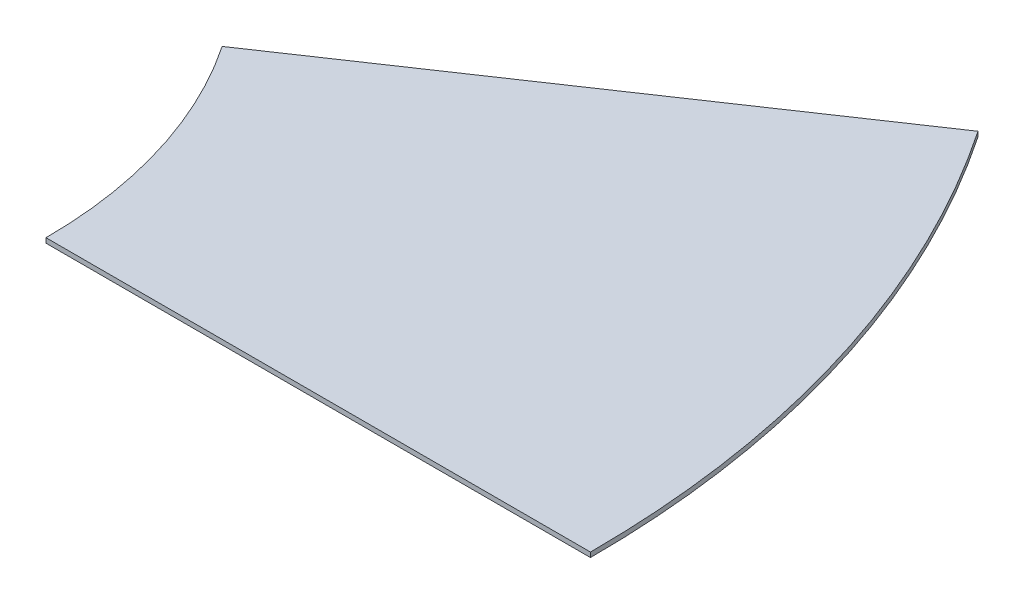
ISO-10303-21;
HEADER;
FILE_DESCRIPTION(('STEP AP214'),'2;1');
FILE_NAME('part.step','',(''),(''),'','','');
FILE_SCHEMA(('AUTOMOTIVE_DESIGN { 1 0 10303 214 1 1 1 1 }'));
ENDSEC;
DATA;
#1=APPLICATION_CONTEXT('core data for automotive mechanical design processes');
#2=APPLICATION_PROTOCOL_DEFINITION('international standard','automotive_design',2000,#1);
#3=PRODUCT_CONTEXT('',#1,'mechanical');
#4=PRODUCT('Part','Part','',(#3));
#5=PRODUCT_RELATED_PRODUCT_CATEGORY('part','',(#4));
#6=PRODUCT_DEFINITION_FORMATION('','',#4);
#7=PRODUCT_DEFINITION_CONTEXT('part definition',#1,'design');
#8=PRODUCT_DEFINITION('design','',#6,#7);
#9=PRODUCT_DEFINITION_SHAPE('','',#8);
#10=(LENGTH_UNIT() NAMED_UNIT(*) SI_UNIT(.MILLI.,.METRE.));
#11=(NAMED_UNIT(*) PLANE_ANGLE_UNIT() SI_UNIT($,.RADIAN.));
#12=(NAMED_UNIT(*) SI_UNIT($,.STERADIAN.) SOLID_ANGLE_UNIT());
#13=UNCERTAINTY_MEASURE_WITH_UNIT(LENGTH_MEASURE(1.E-05),#10,'distance_accuracy_value','');
#14=(GEOMETRIC_REPRESENTATION_CONTEXT(3) GLOBAL_UNCERTAINTY_ASSIGNED_CONTEXT((#13)) GLOBAL_UNIT_ASSIGNED_CONTEXT((#10,
#11,#12)) REPRESENTATION_CONTEXT('',''));
#15=CARTESIAN_POINT('',(0.,0.,0.));
#16=DIRECTION('',(0.,0.,1.));
#17=DIRECTION('',(1.,0.,0.));
#18=AXIS2_PLACEMENT_3D('',#15,#16,#17);
#19=CARTESIAN_POINT('',(0.,0.53,0.));
#20=DIRECTION('',(0.,-1.,0.));
#21=DIRECTION('',(0.,0.,-1.));
#22=AXIS2_PLACEMENT_3D('',#19,#20,#21);
#23=CYLINDRICAL_SURFACE('',#22,110.);
#24=CARTESIAN_POINT('',(0.,0.,0.));
#25=DIRECTION('',(0.,1.,0.));
#26=DIRECTION('',(0.,0.,1.));
#27=AXIS2_PLACEMENT_3D('',#24,#25,#26);
#28=CIRCLE('',#27,110.);
#29=CARTESIAN_POINT('',(110.,0.,0.));
#30=VERTEX_POINT('',#29);
#31=CARTESIAN_POINT('',(91.1941329810549,0.,-61.5112193817816));
#32=VERTEX_POINT('',#31);
#33=EDGE_CURVE('E97',#30,#32,#28,.T.);
#34=ORIENTED_EDGE('',*,*,#33,.T.);
#35=DIRECTION('',(0.,-1.,0.));
#36=VECTOR('',#35,1.);
#37=CARTESIAN_POINT('',(91.1941329810549,0.53,-61.5112193817816));
#38=LINE('',#37,#36);
#39=CARTESIAN_POINT('',(91.1941329810549,0.53,-61.5112193817816));
#40=VERTEX_POINT('',#39);
#41=EDGE_CURVE('E11',#40,#32,#38,.T.);
#42=ORIENTED_EDGE('',*,*,#41,.F.);
#43=CARTESIAN_POINT('',(0.,0.53,0.));
#44=DIRECTION('',(0.,1.,0.));
#45=DIRECTION('',(0.,0.,1.));
#46=AXIS2_PLACEMENT_3D('',#43,#44,#45);
#47=CIRCLE('',#46,110.);
#48=CARTESIAN_POINT('',(110.,0.53,0.));
#49=VERTEX_POINT('',#48);
#50=EDGE_CURVE('E83',#49,#40,#47,.T.);
#51=ORIENTED_EDGE('',*,*,#50,.F.);
#52=DIRECTION('',(0.,-1.,0.));
#53=VECTOR('',#52,1.);
#54=CARTESIAN_POINT('',(110.,0.53,0.));
#55=LINE('',#54,#53);
#56=EDGE_CURVE('E50',#49,#30,#55,.T.);
#57=ORIENTED_EDGE('',*,*,#56,.T.);
#58=EDGE_LOOP('',(#34,#42,#51,#57));
#59=FACE_BOUND('',#58,.T.);
#60=ADVANCED_FACE('F34',(#59),#23,.T.);
#61=CARTESIAN_POINT('',(91.1941329810549,0.53,-61.5112193817816));
#62=DIRECTION('',(0.559192903470742,0.,0.829037572555045));
#63=DIRECTION('',(0.829037572555045,0.,-0.559192903470742));
#64=AXIS2_PLACEMENT_3D('',#61,#62,#63);
#65=PLANE('',#64);
#66=DIRECTION('',(-0.829037572555045,0.,0.559192903470742));
#67=VECTOR('',#66,1.);
#68=CARTESIAN_POINT('',(91.1941329810549,0.,-61.5112193817816));
#69=LINE('',#68,#67);
#70=CARTESIAN_POINT('',(41.4518786277522,0.,-27.9596451735371));
#71=VERTEX_POINT('',#70);
#72=EDGE_CURVE('E88',#32,#71,#69,.T.);
#73=ORIENTED_EDGE('',*,*,#72,.T.);
#74=DIRECTION('',(0.,-1.,0.));
#75=VECTOR('',#74,1.);
#76=CARTESIAN_POINT('',(41.4518786277522,0.53,-27.9596451735371));
#77=LINE('',#76,#75);
#78=CARTESIAN_POINT('',(41.4518786277522,0.53,-27.9596451735371));
#79=VERTEX_POINT('',#78);
#80=EDGE_CURVE('E42',#79,#71,#77,.T.);
#81=ORIENTED_EDGE('',*,*,#80,.F.);
#82=DIRECTION('',(-0.829037572555045,0.,0.559192903470742));
#83=VECTOR('',#82,1.);
#84=CARTESIAN_POINT('',(91.1941329810549,0.53,-61.5112193817816));
#85=LINE('',#84,#83);
#86=EDGE_CURVE('E75',#40,#79,#85,.T.);
#87=ORIENTED_EDGE('',*,*,#86,.F.);
#88=ORIENTED_EDGE('',*,*,#41,.T.);
#89=EDGE_LOOP('',(#73,#81,#87,#88));
#90=FACE_BOUND('',#89,.T.);
#91=ADVANCED_FACE('F87',(#90),#65,.F.);
#92=CARTESIAN_POINT('',(0.,0.53,0.));
#93=DIRECTION('',(0.,-1.,0.));
#94=DIRECTION('',(0.,0.,-1.));
#95=AXIS2_PLACEMENT_3D('',#92,#93,#94);
#96=CYLINDRICAL_SURFACE('',#95,50.);
#97=CARTESIAN_POINT('',(0.,0.,0.));
#98=DIRECTION('',(0.,1.,0.));
#99=DIRECTION('',(0.,0.,1.));
#100=AXIS2_PLACEMENT_3D('',#97,#98,#99);
#101=CIRCLE('',#100,50.);
#102=CARTESIAN_POINT('',(50.,0.,0.));
#103=VERTEX_POINT('',#102);
#104=EDGE_CURVE('E100',#103,#71,#101,.T.);
#105=ORIENTED_EDGE('',*,*,#104,.F.);
#106=DIRECTION('',(0.,-1.,0.));
#107=VECTOR('',#106,1.);
#108=CARTESIAN_POINT('',(50.,0.53,0.));
#109=LINE('',#108,#107);
#110=CARTESIAN_POINT('',(50.,0.53,0.));
#111=VERTEX_POINT('',#110);
#112=EDGE_CURVE('E64',#111,#103,#109,.T.);
#113=ORIENTED_EDGE('',*,*,#112,.F.);
#114=CARTESIAN_POINT('',(0.,0.53,0.));
#115=DIRECTION('',(0.,1.,0.));
#116=DIRECTION('',(0.,0.,1.));
#117=AXIS2_PLACEMENT_3D('',#114,#115,#116);
#118=CIRCLE('',#117,50.);
#119=EDGE_CURVE('E82',#111,#79,#118,.T.);
#120=ORIENTED_EDGE('',*,*,#119,.T.);
#121=ORIENTED_EDGE('',*,*,#80,.T.);
#122=EDGE_LOOP('',(#105,#113,#120,#121));
#123=FACE_BOUND('',#122,.T.);
#124=ADVANCED_FACE('F91',(#123),#96,.F.);
#125=CARTESIAN_POINT('',(110.,0.53,0.));
#126=DIRECTION('',(0.,0.,1.));
#127=DIRECTION('',(1.,0.,0.));
#128=AXIS2_PLACEMENT_3D('',#125,#126,#127);
#129=PLANE('',#128);
#130=DIRECTION('',(-1.,0.,0.));
#131=VECTOR('',#130,1.);
#132=CARTESIAN_POINT('',(110.,0.,0.));
#133=LINE('',#132,#131);
#134=EDGE_CURVE('E102',#30,#103,#133,.T.);
#135=ORIENTED_EDGE('',*,*,#134,.F.);
#136=ORIENTED_EDGE('',*,*,#56,.F.);
#137=DIRECTION('',(-1.,0.,0.));
#138=VECTOR('',#137,1.);
#139=CARTESIAN_POINT('',(110.,0.53,0.));
#140=LINE('',#139,#138);
#141=EDGE_CURVE('E92',#49,#111,#140,.T.);
#142=ORIENTED_EDGE('',*,*,#141,.T.);
#143=ORIENTED_EDGE('',*,*,#112,.T.);
#144=EDGE_LOOP('',(#135,#136,#142,#143));
#145=FACE_BOUND('',#144,.T.);
#146=ADVANCED_FACE('F108',(#145),#129,.T.);
#147=CARTESIAN_POINT('',(0.,0.53,0.));
#148=DIRECTION('',(0.,1.,0.));
#149=DIRECTION('',(0.,0.,1.));
#150=AXIS2_PLACEMENT_3D('',#147,#148,#149);
#151=PLANE('',#150);
#152=ORIENTED_EDGE('',*,*,#50,.T.);
#153=ORIENTED_EDGE('',*,*,#86,.T.);
#154=ORIENTED_EDGE('',*,*,#119,.F.);
#155=ORIENTED_EDGE('',*,*,#141,.F.);
#156=EDGE_LOOP('',(#152,#153,#154,#155));
#157=FACE_BOUND('',#156,.T.);
#158=ADVANCED_FACE('F79',(#157),#151,.T.);
#159=CARTESIAN_POINT('',(0.,0.,0.));
#160=DIRECTION('',(0.,1.,0.));
#161=DIRECTION('',(0.,0.,1.));
#162=AXIS2_PLACEMENT_3D('',#159,#160,#161);
#163=PLANE('',#162);
#164=ORIENTED_EDGE('',*,*,#33,.F.);
#165=ORIENTED_EDGE('',*,*,#134,.T.);
#166=ORIENTED_EDGE('',*,*,#104,.T.);
#167=ORIENTED_EDGE('',*,*,#72,.F.);
#168=EDGE_LOOP('',(#164,#165,#166,#167));
#169=FACE_BOUND('',#168,.T.);
#170=ADVANCED_FACE('F107',(#169),#163,.F.);
#171=CLOSED_SHELL('',(#60,#91,#124,#146,#158,#170));
#172=MANIFOLD_SOLID_BREP('B2',#171);
#173=ADVANCED_BREP_SHAPE_REPRESENTATION('',(#18,#172),#14);
#174=SHAPE_DEFINITION_REPRESENTATION(#9,#173);
ENDSEC;
END-ISO-10303-21;
